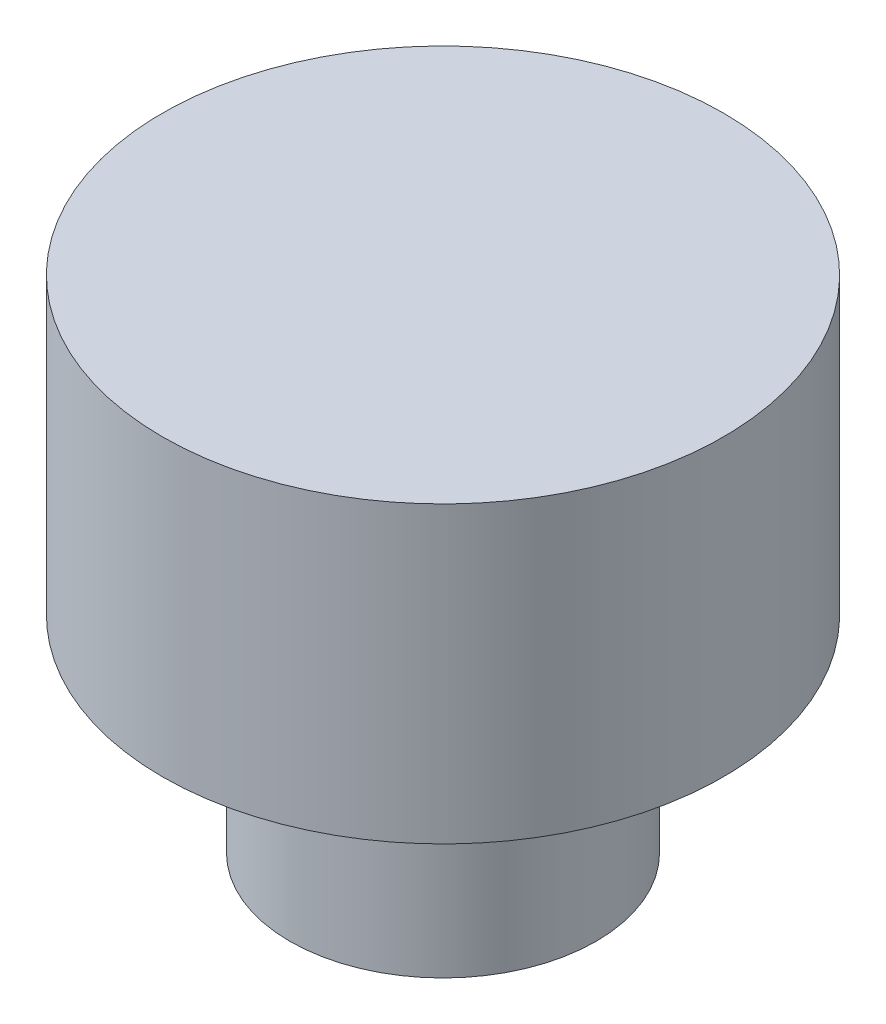
ISO-10303-21;
HEADER;
FILE_DESCRIPTION(('STEP AP214'),'2;1');
FILE_NAME('part.step','',(''),(''),'','','');
FILE_SCHEMA(('AUTOMOTIVE_DESIGN { 1 0 10303 214 1 1 1 1 }'));
ENDSEC;
DATA;
#1=APPLICATION_CONTEXT('core data for automotive mechanical design processes');
#2=APPLICATION_PROTOCOL_DEFINITION('international standard','automotive_design',2000,#1);
#3=PRODUCT_CONTEXT('',#1,'mechanical');
#4=PRODUCT('Part','Part','',(#3));
#5=PRODUCT_RELATED_PRODUCT_CATEGORY('part','',(#4));
#6=PRODUCT_DEFINITION_FORMATION('','',#4);
#7=PRODUCT_DEFINITION_CONTEXT('part definition',#1,'design');
#8=PRODUCT_DEFINITION('design','',#6,#7);
#9=PRODUCT_DEFINITION_SHAPE('','',#8);
#10=(LENGTH_UNIT() NAMED_UNIT(*) SI_UNIT(.MILLI.,.METRE.));
#11=(NAMED_UNIT(*) PLANE_ANGLE_UNIT() SI_UNIT($,.RADIAN.));
#12=(NAMED_UNIT(*) SI_UNIT($,.STERADIAN.) SOLID_ANGLE_UNIT());
#13=UNCERTAINTY_MEASURE_WITH_UNIT(LENGTH_MEASURE(1.E-05),#10,'distance_accuracy_value','');
#14=(GEOMETRIC_REPRESENTATION_CONTEXT(3) GLOBAL_UNCERTAINTY_ASSIGNED_CONTEXT((#13)) GLOBAL_UNIT_ASSIGNED_CONTEXT((#10,
#11,#12)) REPRESENTATION_CONTEXT('',''));
#15=CARTESIAN_POINT('',(0.,0.,0.));
#16=DIRECTION('',(0.,0.,1.));
#17=DIRECTION('',(1.,0.,0.));
#18=AXIS2_PLACEMENT_3D('',#15,#16,#17);
#19=CARTESIAN_POINT('',(0.,7.,0.));
#20=DIRECTION('',(0.,-1.,0.));
#21=DIRECTION('',(0.,0.,-1.));
#22=AXIS2_PLACEMENT_3D('',#19,#20,#21);
#23=CYLINDRICAL_SURFACE('',#22,3.2);
#24=CARTESIAN_POINT('',(0.,0.,0.));
#25=DIRECTION('',(0.,1.,0.));
#26=DIRECTION('',(0.,0.,1.));
#27=AXIS2_PLACEMENT_3D('',#24,#25,#26);
#28=CIRCLE('',#27,3.2);
#29=CARTESIAN_POINT('',(0.,0.,3.2));
#30=VERTEX_POINT('',#29);
#31=EDGE_CURVE('E119',#30,#30,#28,.T.);
#32=ORIENTED_EDGE('',*,*,#31,.F.);
#33=EDGE_LOOP('',(#32));
#34=FACE_BOUND('',#33,.T.);
#35=CARTESIAN_POINT('',(0.,6.2,0.));
#36=DIRECTION('',(0.,-1.,0.));
#37=DIRECTION('',(0.,0.,-1.));
#38=AXIS2_PLACEMENT_3D('',#35,#36,#37);
#39=CIRCLE('',#38,3.2);
#40=CARTESIAN_POINT('',(3.1224989991992,6.2,-0.7));
#41=VERTEX_POINT('',#40);
#42=CARTESIAN_POINT('',(3.1224989991992,6.2,0.7));
#43=VERTEX_POINT('',#42);
#44=EDGE_CURVE('E83',#41,#43,#39,.T.);
#45=ORIENTED_EDGE('',*,*,#44,.F.);
#46=DIRECTION('',(0.,1.,0.));
#47=VECTOR('',#46,1.);
#48=CARTESIAN_POINT('',(3.1224989991992,6.2,-0.7));
#49=LINE('',#48,#47);
#50=CARTESIAN_POINT('',(3.1224989991992,7.,-0.7));
#51=VERTEX_POINT('',#50);
#52=EDGE_CURVE('E89',#41,#51,#49,.T.);
#53=ORIENTED_EDGE('',*,*,#52,.T.);
#54=CARTESIAN_POINT('',(0.,7.,0.));
#55=DIRECTION('',(0.,1.,0.));
#56=DIRECTION('',(0.,0.,1.));
#57=AXIS2_PLACEMENT_3D('',#54,#55,#56);
#58=CIRCLE('',#57,3.2);
#59=CARTESIAN_POINT('',(-3.1224989991992,7.,-0.7));
#60=VERTEX_POINT('',#59);
#61=EDGE_CURVE('E118',#51,#60,#58,.T.);
#62=ORIENTED_EDGE('',*,*,#61,.T.);
#63=DIRECTION('',(0.,1.,0.));
#64=VECTOR('',#63,1.);
#65=CARTESIAN_POINT('',(-3.1224989991992,6.2,-0.7));
#66=LINE('',#65,#64);
#67=CARTESIAN_POINT('',(-3.1224989991992,6.2,-0.7));
#68=VERTEX_POINT('',#67);
#69=EDGE_CURVE('E96',#68,#60,#66,.T.);
#70=ORIENTED_EDGE('',*,*,#69,.F.);
#71=CARTESIAN_POINT('',(-3.1224989991992,6.2,0.7));
#72=VERTEX_POINT('',#71);
#73=EDGE_CURVE('E85',#72,#68,#39,.T.);
#74=ORIENTED_EDGE('',*,*,#73,.F.);
#75=DIRECTION('',(0.,1.,0.));
#76=VECTOR('',#75,1.);
#77=CARTESIAN_POINT('',(-3.1224989991992,6.2,0.7));
#78=LINE('',#77,#76);
#79=CARTESIAN_POINT('',(-3.1224989991992,7.,0.7));
#80=VERTEX_POINT('',#79);
#81=EDGE_CURVE('E58',#72,#80,#78,.T.);
#82=ORIENTED_EDGE('',*,*,#81,.T.);
#83=CARTESIAN_POINT('',(3.1224989991992,7.,0.7));
#84=VERTEX_POINT('',#83);
#85=EDGE_CURVE('E114',#80,#84,#58,.T.);
#86=ORIENTED_EDGE('',*,*,#85,.T.);
#87=DIRECTION('',(0.,1.,0.));
#88=VECTOR('',#87,1.);
#89=CARTESIAN_POINT('',(3.1224989991992,6.2,0.7));
#90=LINE('',#89,#88);
#91=EDGE_CURVE('E52',#43,#84,#90,.T.);
#92=ORIENTED_EDGE('',*,*,#91,.F.);
#93=EDGE_LOOP('',(#45,#53,#62,#70,#74,#82,#86,#92));
#94=FACE_BOUND('',#93,.T.);
#95=ADVANCED_FACE('F37',(#34,#94),#23,.F.);
#96=CARTESIAN_POINT('',(0.,7.,0.));
#97=DIRECTION('',(0.,1.,0.));
#98=DIRECTION('',(0.,0.,1.));
#99=AXIS2_PLACEMENT_3D('',#96,#97,#98);
#100=PLANE('',#99);
#101=DIRECTION('',(1.,0.,0.));
#102=VECTOR('',#101,1.);
#103=CARTESIAN_POINT('',(0.,7.,-0.7));
#104=LINE('',#103,#102);
#105=EDGE_CURVE('E92',#60,#51,#104,.T.);
#106=ORIENTED_EDGE('',*,*,#105,.F.);
#107=ORIENTED_EDGE('',*,*,#61,.F.);
#108=EDGE_LOOP('',(#106,#107));
#109=FACE_BOUND('',#108,.T.);
#110=ADVANCED_FACE('F125',(#109),#100,.F.);
#111=CARTESIAN_POINT('',(0.,0.,0.));
#112=DIRECTION('',(0.,1.,0.));
#113=DIRECTION('',(0.,0.,1.));
#114=AXIS2_PLACEMENT_3D('',#111,#112,#113);
#115=PLANE('',#114);
#116=CARTESIAN_POINT('',(0.,0.,0.));
#117=DIRECTION('',(0.,1.,0.));
#118=DIRECTION('',(0.,0.,1.));
#119=AXIS2_PLACEMENT_3D('',#116,#117,#118);
#120=CIRCLE('',#119,5.2);
#121=CARTESIAN_POINT('',(0.,0.,5.2));
#122=VERTEX_POINT('',#121);
#123=EDGE_CURVE('E41',#122,#122,#120,.T.);
#124=ORIENTED_EDGE('',*,*,#123,.F.);
#125=EDGE_LOOP('',(#124));
#126=FACE_BOUND('',#125,.T.);
#127=ORIENTED_EDGE('',*,*,#31,.T.);
#128=EDGE_LOOP('',(#127));
#129=FACE_BOUND('',#128,.T.);
#130=ADVANCED_FACE('F127',(#126,#129),#115,.F.);
#131=CARTESIAN_POINT('',(0.,7.,0.));
#132=DIRECTION('',(0.,-1.,0.));
#133=DIRECTION('',(0.,0.,-1.));
#134=AXIS2_PLACEMENT_3D('',#131,#132,#133);
#135=CYLINDRICAL_SURFACE('',#134,5.2);
#136=CARTESIAN_POINT('',(0.,7.,0.));
#137=DIRECTION('',(0.,1.,0.));
#138=DIRECTION('',(0.,0.,1.));
#139=AXIS2_PLACEMENT_3D('',#136,#137,#138);
#140=CIRCLE('',#139,5.2);
#141=CARTESIAN_POINT('',(0.,7.,5.2));
#142=VERTEX_POINT('',#141);
#143=EDGE_CURVE('E11',#142,#142,#140,.T.);
#144=ORIENTED_EDGE('',*,*,#143,.F.);
#145=EDGE_LOOP('',(#144));
#146=FACE_BOUND('',#145,.T.);
#147=ORIENTED_EDGE('',*,*,#123,.T.);
#148=EDGE_LOOP('',(#147));
#149=FACE_BOUND('',#148,.T.);
#150=ADVANCED_FACE('F39',(#146,#149),#135,.T.);
#151=ORIENTED_EDGE('',*,*,#85,.F.);
#152=DIRECTION('',(1.,0.,0.));
#153=VECTOR('',#152,1.);
#154=CARTESIAN_POINT('',(0.,7.,0.7));
#155=LINE('',#154,#153);
#156=EDGE_CURVE('E72',#80,#84,#155,.T.);
#157=ORIENTED_EDGE('',*,*,#156,.T.);
#158=EDGE_LOOP('',(#151,#157));
#159=FACE_BOUND('',#158,.T.);
#160=ADVANCED_FACE('F129',(#159),#100,.F.);
#161=CARTESIAN_POINT('',(0.,17.,0.));
#162=DIRECTION('',(0.,-1.,0.));
#163=DIRECTION('',(0.,0.,-1.));
#164=AXIS2_PLACEMENT_3D('',#161,#162,#163);
#165=CYLINDRICAL_SURFACE('',#164,9.525);
#166=CARTESIAN_POINT('',(0.,17.,0.));
#167=DIRECTION('',(0.,1.,0.));
#168=DIRECTION('',(0.,0.,1.));
#169=AXIS2_PLACEMENT_3D('',#166,#167,#168);
#170=CIRCLE('',#169,9.525);
#171=CARTESIAN_POINT('',(0.,17.,9.525));
#172=VERTEX_POINT('',#171);
#173=EDGE_CURVE('E111',#172,#172,#170,.T.);
#174=ORIENTED_EDGE('',*,*,#173,.F.);
#175=EDGE_LOOP('',(#174));
#176=FACE_BOUND('',#175,.T.);
#177=CARTESIAN_POINT('',(0.,7.,0.));
#178=DIRECTION('',(0.,1.,0.));
#179=DIRECTION('',(0.,0.,1.));
#180=AXIS2_PLACEMENT_3D('',#177,#178,#179);
#181=CIRCLE('',#180,9.525);
#182=CARTESIAN_POINT('',(0.,7.,9.525));
#183=VERTEX_POINT('',#182);
#184=EDGE_CURVE('E110',#183,#183,#181,.T.);
#185=ORIENTED_EDGE('',*,*,#184,.T.);
#186=EDGE_LOOP('',(#185));
#187=FACE_BOUND('',#186,.T.);
#188=ADVANCED_FACE('F141',(#176,#187),#165,.T.);
#189=CARTESIAN_POINT('',(0.,17.,0.));
#190=DIRECTION('',(0.,1.,0.));
#191=DIRECTION('',(0.,0.,1.));
#192=AXIS2_PLACEMENT_3D('',#189,#190,#191);
#193=PLANE('',#192);
#194=ORIENTED_EDGE('',*,*,#173,.T.);
#195=EDGE_LOOP('',(#194));
#196=FACE_BOUND('',#195,.T.);
#197=ADVANCED_FACE('F143',(#196),#193,.T.);
#198=ORIENTED_EDGE('',*,*,#143,.T.);
#199=EDGE_LOOP('',(#198));
#200=FACE_BOUND('',#199,.T.);
#201=ORIENTED_EDGE('',*,*,#184,.F.);
#202=EDGE_LOOP('',(#201));
#203=FACE_BOUND('',#202,.T.);
#204=ADVANCED_FACE('F130',(#200,#203),#100,.F.);
#205=CARTESIAN_POINT('',(0.,6.2,-0.7));
#206=DIRECTION('',(0.,0.,1.));
#207=DIRECTION('',(1.,0.,0.));
#208=AXIS2_PLACEMENT_3D('',#205,#206,#207);
#209=PLANE('',#208);
#210=ORIENTED_EDGE('',*,*,#105,.T.);
#211=ORIENTED_EDGE('',*,*,#52,.F.);
#212=DIRECTION('',(1.,0.,0.));
#213=VECTOR('',#212,1.);
#214=CARTESIAN_POINT('',(0.,6.2,-0.7));
#215=LINE('',#214,#213);
#216=EDGE_CURVE('E78',#68,#41,#215,.T.);
#217=ORIENTED_EDGE('',*,*,#216,.F.);
#218=ORIENTED_EDGE('',*,*,#69,.T.);
#219=EDGE_LOOP('',(#210,#211,#217,#218));
#220=FACE_BOUND('',#219,.T.);
#221=ADVANCED_FACE('F90',(#220),#209,.F.);
#222=CARTESIAN_POINT('',(0.,6.2,0.7));
#223=DIRECTION('',(0.,0.,1.));
#224=DIRECTION('',(1.,0.,0.));
#225=AXIS2_PLACEMENT_3D('',#222,#223,#224);
#226=PLANE('',#225);
#227=ORIENTED_EDGE('',*,*,#156,.F.);
#228=ORIENTED_EDGE('',*,*,#81,.F.);
#229=DIRECTION('',(1.,0.,0.));
#230=VECTOR('',#229,1.);
#231=CARTESIAN_POINT('',(0.,6.2,0.7));
#232=LINE('',#231,#230);
#233=EDGE_CURVE('E99',#72,#43,#232,.T.);
#234=ORIENTED_EDGE('',*,*,#233,.T.);
#235=ORIENTED_EDGE('',*,*,#91,.T.);
#236=EDGE_LOOP('',(#227,#228,#234,#235));
#237=FACE_BOUND('',#236,.T.);
#238=ADVANCED_FACE('F149',(#237),#226,.T.);
#239=CARTESIAN_POINT('',(0.,6.2,0.));
#240=DIRECTION('',(0.,-1.,0.));
#241=DIRECTION('',(0.,0.,-1.));
#242=AXIS2_PLACEMENT_3D('',#239,#240,#241);
#243=PLANE('',#242);
#244=ORIENTED_EDGE('',*,*,#73,.T.);
#245=ORIENTED_EDGE('',*,*,#216,.T.);
#246=ORIENTED_EDGE('',*,*,#44,.T.);
#247=ORIENTED_EDGE('',*,*,#233,.F.);
#248=EDGE_LOOP('',(#244,#245,#246,#247));
#249=FACE_BOUND('',#248,.T.);
#250=ADVANCED_FACE('F81',(#249),#243,.T.);
#251=CLOSED_SHELL('',(#95,#110,#130,#150,#160,#188,#197,#204,#221,#238,#250));
#252=MANIFOLD_SOLID_BREP('B2',#251);
#253=ADVANCED_BREP_SHAPE_REPRESENTATION('',(#18,#252),#14);
#254=SHAPE_DEFINITION_REPRESENTATION(#9,#253);
ENDSEC;
END-ISO-10303-21;
